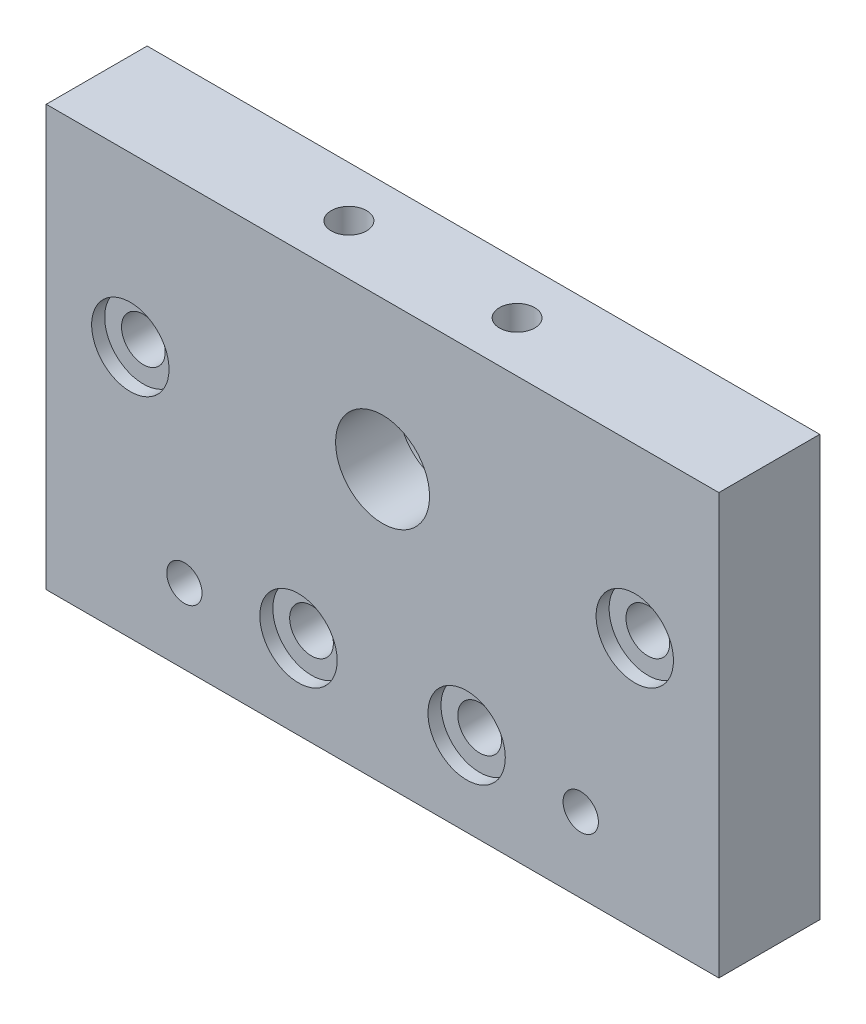
ISO-10303-21;
HEADER;
FILE_DESCRIPTION(('STEP AP214'),'2;1');
FILE_NAME('part.step','',(''),(''),'','','');
FILE_SCHEMA(('AUTOMOTIVE_DESIGN { 1 0 10303 214 1 1 1 1 }'));
ENDSEC;
DATA;
#1=APPLICATION_CONTEXT('core data for automotive mechanical design processes');
#2=APPLICATION_PROTOCOL_DEFINITION('international standard','automotive_design',2000,#1);
#3=PRODUCT_CONTEXT('',#1,'mechanical');
#4=PRODUCT('Part','Part','',(#3));
#5=PRODUCT_RELATED_PRODUCT_CATEGORY('part','',(#4));
#6=PRODUCT_DEFINITION_FORMATION('','',#4);
#7=PRODUCT_DEFINITION_CONTEXT('part definition',#1,'design');
#8=PRODUCT_DEFINITION('design','',#6,#7);
#9=PRODUCT_DEFINITION_SHAPE('','',#8);
#10=(LENGTH_UNIT() NAMED_UNIT(*) SI_UNIT(.MILLI.,.METRE.));
#11=(NAMED_UNIT(*) PLANE_ANGLE_UNIT() SI_UNIT($,.RADIAN.));
#12=(NAMED_UNIT(*) SI_UNIT($,.STERADIAN.) SOLID_ANGLE_UNIT());
#13=UNCERTAINTY_MEASURE_WITH_UNIT(LENGTH_MEASURE(1.E-05),#10,'distance_accuracy_value','');
#14=(GEOMETRIC_REPRESENTATION_CONTEXT(3) GLOBAL_UNCERTAINTY_ASSIGNED_CONTEXT((#13)) GLOBAL_UNIT_ASSIGNED_CONTEXT((#10,
#11,#12)) REPRESENTATION_CONTEXT('',''));
#15=CARTESIAN_POINT('',(0.,0.,0.));
#16=DIRECTION('',(0.,0.,1.));
#17=DIRECTION('',(1.,0.,0.));
#18=AXIS2_PLACEMENT_3D('',#15,#16,#17);
#19=CARTESIAN_POINT('',(40.,32.4,12.));
#20=DIRECTION('',(0.,0.,-1.));
#21=DIRECTION('',(-1.,0.,0.));
#22=AXIS2_PLACEMENT_3D('',#19,#20,#21);
#23=CYLINDRICAL_SURFACE('',#22,5.588);
#24=CARTESIAN_POINT('',(40.,32.4,12.));
#25=DIRECTION('',(0.,0.,1.));
#26=DIRECTION('',(1.,0.,0.));
#27=AXIS2_PLACEMENT_3D('',#24,#25,#26);
#28=CIRCLE('',#27,5.588);
#29=CARTESIAN_POINT('',(45.588,32.4,12.));
#30=VERTEX_POINT('',#29);
#31=EDGE_CURVE('E163',#30,#30,#28,.T.);
#32=ORIENTED_EDGE('',*,*,#31,.T.);
#33=EDGE_LOOP('',(#32));
#34=FACE_BOUND('',#33,.T.);
#35=CARTESIAN_POINT('',(40.,32.4,4.5));
#36=DIRECTION('',(0.,0.,-1.));
#37=DIRECTION('',(-1.,0.,0.));
#38=AXIS2_PLACEMENT_3D('',#35,#36,#37);
#39=CIRCLE('',#38,5.588);
#40=CARTESIAN_POINT('',(34.412,32.4,4.5));
#41=VERTEX_POINT('',#40);
#42=EDGE_CURVE('E36',#41,#41,#39,.T.);
#43=ORIENTED_EDGE('',*,*,#42,.T.);
#44=EDGE_LOOP('',(#43));
#45=FACE_BOUND('',#44,.T.);
#46=ADVANCED_FACE('F32',(#34,#45),#23,.F.);
#47=CARTESIAN_POINT('',(70.,30.,12.));
#48=DIRECTION('',(0.,0.,-1.));
#49=DIRECTION('',(-1.,0.,0.));
#50=AXIS2_PLACEMENT_3D('',#47,#48,#49);
#51=CYLINDRICAL_SURFACE('',#50,2.59999999999999);
#52=CARTESIAN_POINT('',(70.,30.,0.));
#53=DIRECTION('',(0.,0.,1.));
#54=DIRECTION('',(-1.,0.,0.));
#55=AXIS2_PLACEMENT_3D('',#52,#53,#54);
#56=CIRCLE('',#55,2.59999999999999);
#57=CARTESIAN_POINT('',(67.4,30.,0.));
#58=VERTEX_POINT('',#57);
#59=EDGE_CURVE('E151',#58,#58,#56,.T.);
#60=ORIENTED_EDGE('',*,*,#59,.F.);
#61=EDGE_LOOP('',(#60));
#62=FACE_BOUND('',#61,.T.);
#63=CARTESIAN_POINT('',(70.,30.,10.45));
#64=DIRECTION('',(0.,0.,1.));
#65=DIRECTION('',(1.,0.,0.));
#66=AXIS2_PLACEMENT_3D('',#63,#64,#65);
#67=CIRCLE('',#66,2.59999999999999);
#68=CARTESIAN_POINT('',(72.6,30.,10.45));
#69=VERTEX_POINT('',#68);
#70=EDGE_CURVE('E127',#69,#69,#67,.T.);
#71=ORIENTED_EDGE('',*,*,#70,.T.);
#72=EDGE_LOOP('',(#71));
#73=FACE_BOUND('',#72,.T.);
#74=ADVANCED_FACE('F192',(#62,#73),#51,.F.);
#75=CARTESIAN_POINT('',(50.,10.,12.));
#76=DIRECTION('',(0.,0.,-1.));
#77=DIRECTION('',(-1.,0.,0.));
#78=AXIS2_PLACEMENT_3D('',#75,#76,#77);
#79=CYLINDRICAL_SURFACE('',#78,2.59999999999999);
#80=CARTESIAN_POINT('',(50.,10.,0.));
#81=DIRECTION('',(0.,0.,1.));
#82=DIRECTION('',(-1.,0.,0.));
#83=AXIS2_PLACEMENT_3D('',#80,#81,#82);
#84=CIRCLE('',#83,2.59999999999999);
#85=CARTESIAN_POINT('',(47.4,10.,0.));
#86=VERTEX_POINT('',#85);
#87=EDGE_CURVE('E154',#86,#86,#84,.T.);
#88=ORIENTED_EDGE('',*,*,#87,.F.);
#89=EDGE_LOOP('',(#88));
#90=FACE_BOUND('',#89,.T.);
#91=CARTESIAN_POINT('',(50.,10.,10.45));
#92=DIRECTION('',(0.,0.,1.));
#93=DIRECTION('',(1.,0.,0.));
#94=AXIS2_PLACEMENT_3D('',#91,#92,#93);
#95=CIRCLE('',#94,2.59999999999999);
#96=CARTESIAN_POINT('',(52.6,10.,10.45));
#97=VERTEX_POINT('',#96);
#98=EDGE_CURVE('E133',#97,#97,#95,.T.);
#99=ORIENTED_EDGE('',*,*,#98,.T.);
#100=EDGE_LOOP('',(#99));
#101=FACE_BOUND('',#100,.T.);
#102=ADVANCED_FACE('F260',(#90,#101),#79,.F.);
#103=CARTESIAN_POINT('',(30.,10.,12.));
#104=DIRECTION('',(0.,0.,-1.));
#105=DIRECTION('',(-1.,0.,0.));
#106=AXIS2_PLACEMENT_3D('',#103,#104,#105);
#107=CYLINDRICAL_SURFACE('',#106,2.59999999999999);
#108=CARTESIAN_POINT('',(30.,10.,0.));
#109=DIRECTION('',(0.,0.,1.));
#110=DIRECTION('',(1.,0.,0.));
#111=AXIS2_PLACEMENT_3D('',#108,#109,#110);
#112=CIRCLE('',#111,2.59999999999999);
#113=CARTESIAN_POINT('',(32.6,10.,0.));
#114=VERTEX_POINT('',#113);
#115=EDGE_CURVE('E160',#114,#114,#112,.T.);
#116=ORIENTED_EDGE('',*,*,#115,.F.);
#117=EDGE_LOOP('',(#116));
#118=FACE_BOUND('',#117,.T.);
#119=CARTESIAN_POINT('',(30.,10.,10.45));
#120=DIRECTION('',(0.,0.,1.));
#121=DIRECTION('',(1.,0.,0.));
#122=AXIS2_PLACEMENT_3D('',#119,#120,#121);
#123=CIRCLE('',#122,2.59999999999999);
#124=CARTESIAN_POINT('',(32.6,10.,10.45));
#125=VERTEX_POINT('',#124);
#126=EDGE_CURVE('E140',#125,#125,#123,.T.);
#127=ORIENTED_EDGE('',*,*,#126,.T.);
#128=EDGE_LOOP('',(#127));
#129=FACE_BOUND('',#128,.T.);
#130=ADVANCED_FACE('F265',(#118,#129),#107,.F.);
#131=CARTESIAN_POINT('',(9.99999999999999,30.,12.));
#132=DIRECTION('',(0.,0.,-1.));
#133=DIRECTION('',(-1.,0.,0.));
#134=AXIS2_PLACEMENT_3D('',#131,#132,#133);
#135=CYLINDRICAL_SURFACE('',#134,2.6);
#136=CARTESIAN_POINT('',(9.99999999999999,30.,0.));
#137=DIRECTION('',(0.,0.,1.));
#138=DIRECTION('',(1.,0.,0.));
#139=AXIS2_PLACEMENT_3D('',#136,#137,#138);
#140=CIRCLE('',#139,2.6);
#141=CARTESIAN_POINT('',(12.6,30.,0.));
#142=VERTEX_POINT('',#141);
#143=EDGE_CURVE('E157',#142,#142,#140,.T.);
#144=ORIENTED_EDGE('',*,*,#143,.F.);
#145=EDGE_LOOP('',(#144));
#146=FACE_BOUND('',#145,.T.);
#147=CARTESIAN_POINT('',(9.99999999999999,30.,10.45));
#148=DIRECTION('',(0.,0.,1.));
#149=DIRECTION('',(1.,0.,0.));
#150=AXIS2_PLACEMENT_3D('',#147,#148,#149);
#151=CIRCLE('',#150,2.6);
#152=CARTESIAN_POINT('',(12.6,30.,10.45));
#153=VERTEX_POINT('',#152);
#154=EDGE_CURVE('E147',#153,#153,#151,.T.);
#155=ORIENTED_EDGE('',*,*,#154,.T.);
#156=EDGE_LOOP('',(#155));
#157=FACE_BOUND('',#156,.T.);
#158=ADVANCED_FACE('F212',(#146,#157),#135,.F.);
#159=CARTESIAN_POINT('',(0.,0.,12.));
#160=DIRECTION('',(0.,0.,-1.));
#161=DIRECTION('',(-1.,0.,0.));
#162=AXIS2_PLACEMENT_3D('',#159,#160,#161);
#163=PLANE('',#162);
#164=CARTESIAN_POINT('',(16.43,8.9,12.));
#165=DIRECTION('',(0.,0.,1.));
#166=DIRECTION('',(1.,0.,0.));
#167=AXIS2_PLACEMENT_3D('',#164,#165,#166);
#168=CIRCLE('',#167,2.09999999999999);
#169=CARTESIAN_POINT('',(18.53,8.9,12.));
#170=VERTEX_POINT('',#169);
#171=EDGE_CURVE('E111',#170,#170,#168,.T.);
#172=ORIENTED_EDGE('',*,*,#171,.F.);
#173=EDGE_LOOP('',(#172));
#174=FACE_BOUND('',#173,.T.);
#175=CARTESIAN_POINT('',(63.57,8.90000000000001,12.));
#176=DIRECTION('',(0.,0.,1.));
#177=DIRECTION('',(1.,0.,0.));
#178=AXIS2_PLACEMENT_3D('',#175,#176,#177);
#179=CIRCLE('',#178,2.09999999999999);
#180=CARTESIAN_POINT('',(65.67,8.90000000000001,12.));
#181=VERTEX_POINT('',#180);
#182=EDGE_CURVE('E117',#181,#181,#179,.T.);
#183=ORIENTED_EDGE('',*,*,#182,.F.);
#184=EDGE_LOOP('',(#183));
#185=FACE_BOUND('',#184,.T.);
#186=CARTESIAN_POINT('',(70.,30.,12.));
#187=DIRECTION('',(0.,0.,1.));
#188=DIRECTION('',(1.,0.,0.));
#189=AXIS2_PLACEMENT_3D('',#186,#187,#188);
#190=CIRCLE('',#189,4.6);
#191=CARTESIAN_POINT('',(74.6,30.,12.));
#192=VERTEX_POINT('',#191);
#193=EDGE_CURVE('E123',#192,#192,#190,.T.);
#194=ORIENTED_EDGE('',*,*,#193,.F.);
#195=EDGE_LOOP('',(#194));
#196=FACE_BOUND('',#195,.T.);
#197=CARTESIAN_POINT('',(50.,10.,12.));
#198=DIRECTION('',(0.,0.,1.));
#199=DIRECTION('',(1.,0.,0.));
#200=AXIS2_PLACEMENT_3D('',#197,#198,#199);
#201=CIRCLE('',#200,4.6);
#202=CARTESIAN_POINT('',(54.6,10.,12.));
#203=VERTEX_POINT('',#202);
#204=EDGE_CURVE('E134',#203,#203,#201,.T.);
#205=ORIENTED_EDGE('',*,*,#204,.F.);
#206=EDGE_LOOP('',(#205));
#207=FACE_BOUND('',#206,.T.);
#208=CARTESIAN_POINT('',(30.,10.,12.));
#209=DIRECTION('',(0.,0.,1.));
#210=DIRECTION('',(1.,0.,0.));
#211=AXIS2_PLACEMENT_3D('',#208,#209,#210);
#212=CIRCLE('',#211,4.6);
#213=CARTESIAN_POINT('',(34.6,10.,12.));
#214=VERTEX_POINT('',#213);
#215=EDGE_CURVE('E141',#214,#214,#212,.T.);
#216=ORIENTED_EDGE('',*,*,#215,.F.);
#217=EDGE_LOOP('',(#216));
#218=FACE_BOUND('',#217,.T.);
#219=CARTESIAN_POINT('',(9.99999999999999,30.,12.));
#220=DIRECTION('',(0.,0.,1.));
#221=DIRECTION('',(1.,0.,0.));
#222=AXIS2_PLACEMENT_3D('',#219,#220,#221);
#223=CIRCLE('',#222,4.6);
#224=CARTESIAN_POINT('',(14.6,30.,12.));
#225=VERTEX_POINT('',#224);
#226=EDGE_CURVE('E148',#225,#225,#223,.T.);
#227=ORIENTED_EDGE('',*,*,#226,.F.);
#228=EDGE_LOOP('',(#227));
#229=FACE_BOUND('',#228,.T.);
#230=DIRECTION('',(0.,-1.,0.));
#231=VECTOR('',#230,1.);
#232=CARTESIAN_POINT('',(0.,0.,12.));
#233=LINE('',#232,#231);
#234=CARTESIAN_POINT('',(0.,50.,12.));
#235=VERTEX_POINT('',#234);
#236=CARTESIAN_POINT('',(0.,0.,12.));
#237=VERTEX_POINT('',#236);
#238=EDGE_CURVE('E167',#235,#237,#233,.T.);
#239=ORIENTED_EDGE('',*,*,#238,.T.);
#240=DIRECTION('',(1.,0.,0.));
#241=VECTOR('',#240,1.);
#242=CARTESIAN_POINT('',(0.,0.,12.));
#243=LINE('',#242,#241);
#244=CARTESIAN_POINT('',(80.,0.,12.));
#245=VERTEX_POINT('',#244);
#246=EDGE_CURVE('E82',#237,#245,#243,.T.);
#247=ORIENTED_EDGE('',*,*,#246,.T.);
#248=DIRECTION('',(0.,1.,0.));
#249=VECTOR('',#248,1.);
#250=CARTESIAN_POINT('',(80.,0.,12.));
#251=LINE('',#250,#249);
#252=CARTESIAN_POINT('',(80.,50.,12.));
#253=VERTEX_POINT('',#252);
#254=EDGE_CURVE('E170',#245,#253,#251,.T.);
#255=ORIENTED_EDGE('',*,*,#254,.T.);
#256=DIRECTION('',(-1.,0.,0.));
#257=VECTOR('',#256,1.);
#258=CARTESIAN_POINT('',(0.,50.,12.));
#259=LINE('',#258,#257);
#260=EDGE_CURVE('E51',#253,#235,#259,.T.);
#261=ORIENTED_EDGE('',*,*,#260,.T.);
#262=EDGE_LOOP('',(#239,#247,#255,#261));
#263=FACE_BOUND('',#262,.T.);
#264=ORIENTED_EDGE('',*,*,#31,.F.);
#265=EDGE_LOOP('',(#264));
#266=FACE_BOUND('',#265,.T.);
#267=ADVANCED_FACE('F208',(#174,#185,#196,#207,#218,#229,#263,#266),#163,.F.);
#268=CARTESIAN_POINT('',(0.,0.,0.));
#269=DIRECTION('',(0.,0.,-1.));
#270=DIRECTION('',(-1.,0.,0.));
#271=AXIS2_PLACEMENT_3D('',#268,#269,#270);
#272=PLANE('',#271);
#273=CARTESIAN_POINT('',(40.,32.4,0.));
#274=DIRECTION('',(0.,0.,-1.));
#275=DIRECTION('',(-1.,0.,0.));
#276=AXIS2_PLACEMENT_3D('',#273,#274,#275);
#277=CIRCLE('',#276,8.05);
#278=CARTESIAN_POINT('',(31.95,32.4,0.));
#279=VERTEX_POINT('',#278);
#280=EDGE_CURVE('E233',#279,#279,#277,.T.);
#281=ORIENTED_EDGE('',*,*,#280,.F.);
#282=EDGE_LOOP('',(#281));
#283=FACE_BOUND('',#282,.T.);
#284=CARTESIAN_POINT('',(16.43,8.9,0.));
#285=DIRECTION('',(0.,0.,1.));
#286=DIRECTION('',(1.,0.,0.));
#287=AXIS2_PLACEMENT_3D('',#284,#285,#286);
#288=CIRCLE('',#287,2.1);
#289=CARTESIAN_POINT('',(18.53,8.9,0.));
#290=VERTEX_POINT('',#289);
#291=EDGE_CURVE('E114',#290,#290,#288,.T.);
#292=ORIENTED_EDGE('',*,*,#291,.T.);
#293=EDGE_LOOP('',(#292));
#294=FACE_BOUND('',#293,.T.);
#295=CARTESIAN_POINT('',(63.57,8.90000000000001,0.));
#296=DIRECTION('',(0.,0.,1.));
#297=DIRECTION('',(1.,0.,0.));
#298=AXIS2_PLACEMENT_3D('',#295,#296,#297);
#299=CIRCLE('',#298,2.1);
#300=CARTESIAN_POINT('',(65.67,8.90000000000001,0.));
#301=VERTEX_POINT('',#300);
#302=EDGE_CURVE('E120',#301,#301,#299,.T.);
#303=ORIENTED_EDGE('',*,*,#302,.T.);
#304=EDGE_LOOP('',(#303));
#305=FACE_BOUND('',#304,.T.);
#306=ORIENTED_EDGE('',*,*,#87,.T.);
#307=EDGE_LOOP('',(#306));
#308=FACE_BOUND('',#307,.T.);
#309=ORIENTED_EDGE('',*,*,#115,.T.);
#310=EDGE_LOOP('',(#309));
#311=FACE_BOUND('',#310,.T.);
#312=DIRECTION('',(0.,-1.,0.));
#313=VECTOR('',#312,1.);
#314=CARTESIAN_POINT('',(0.,0.,0.));
#315=LINE('',#314,#313);
#316=CARTESIAN_POINT('',(0.,50.,0.));
#317=VERTEX_POINT('',#316);
#318=CARTESIAN_POINT('',(0.,0.,0.));
#319=VERTEX_POINT('',#318);
#320=EDGE_CURVE('E166',#317,#319,#315,.T.);
#321=ORIENTED_EDGE('',*,*,#320,.F.);
#322=DIRECTION('',(-1.,0.,0.));
#323=VECTOR('',#322,1.);
#324=CARTESIAN_POINT('',(0.,50.,0.));
#325=LINE('',#324,#323);
#326=CARTESIAN_POINT('',(80.,50.,0.));
#327=VERTEX_POINT('',#326);
#328=EDGE_CURVE('E75',#327,#317,#325,.T.);
#329=ORIENTED_EDGE('',*,*,#328,.F.);
#330=DIRECTION('',(0.,1.,0.));
#331=VECTOR('',#330,1.);
#332=CARTESIAN_POINT('',(80.,0.,0.));
#333=LINE('',#332,#331);
#334=CARTESIAN_POINT('',(80.,0.,0.));
#335=VERTEX_POINT('',#334);
#336=EDGE_CURVE('E69',#335,#327,#333,.T.);
#337=ORIENTED_EDGE('',*,*,#336,.F.);
#338=DIRECTION('',(1.,0.,0.));
#339=VECTOR('',#338,1.);
#340=CARTESIAN_POINT('',(0.,0.,0.));
#341=LINE('',#340,#339);
#342=EDGE_CURVE('E176',#319,#335,#341,.T.);
#343=ORIENTED_EDGE('',*,*,#342,.F.);
#344=EDGE_LOOP('',(#321,#329,#337,#343));
#345=FACE_BOUND('',#344,.T.);
#346=ORIENTED_EDGE('',*,*,#143,.T.);
#347=EDGE_LOOP('',(#346));
#348=FACE_BOUND('',#347,.T.);
#349=ORIENTED_EDGE('',*,*,#59,.T.);
#350=EDGE_LOOP('',(#349));
#351=FACE_BOUND('',#350,.T.);
#352=ADVANCED_FACE('F211',(#283,#294,#305,#308,#311,#345,#348,#351),#272,.T.);
#353=CARTESIAN_POINT('',(0.,0.,12.));
#354=DIRECTION('',(1.,0.,0.));
#355=DIRECTION('',(0.,0.,-1.));
#356=AXIS2_PLACEMENT_3D('',#353,#354,#355);
#357=PLANE('',#356);
#358=ORIENTED_EDGE('',*,*,#320,.T.);
#359=DIRECTION('',(0.,0.,-1.));
#360=VECTOR('',#359,1.);
#361=CARTESIAN_POINT('',(0.,0.,12.));
#362=LINE('',#361,#360);
#363=EDGE_CURVE('E11',#237,#319,#362,.T.);
#364=ORIENTED_EDGE('',*,*,#363,.F.);
#365=ORIENTED_EDGE('',*,*,#238,.F.);
#366=DIRECTION('',(0.,0.,-1.));
#367=VECTOR('',#366,1.);
#368=CARTESIAN_POINT('',(0.,50.,12.));
#369=LINE('',#368,#367);
#370=EDGE_CURVE('E173',#235,#317,#369,.T.);
#371=ORIENTED_EDGE('',*,*,#370,.T.);
#372=EDGE_LOOP('',(#358,#364,#365,#371));
#373=FACE_BOUND('',#372,.T.);
#374=ADVANCED_FACE('F34',(#373),#357,.F.);
#375=CARTESIAN_POINT('',(0.,0.,12.));
#376=DIRECTION('',(0.,1.,0.));
#377=DIRECTION('',(0.,0.,1.));
#378=AXIS2_PLACEMENT_3D('',#375,#376,#377);
#379=PLANE('',#378);
#380=ORIENTED_EDGE('',*,*,#342,.T.);
#381=DIRECTION('',(0.,0.,-1.));
#382=VECTOR('',#381,1.);
#383=CARTESIAN_POINT('',(80.,0.,12.));
#384=LINE('',#383,#382);
#385=EDGE_CURVE('E42',#245,#335,#384,.T.);
#386=ORIENTED_EDGE('',*,*,#385,.F.);
#387=ORIENTED_EDGE('',*,*,#246,.F.);
#388=ORIENTED_EDGE('',*,*,#363,.T.);
#389=EDGE_LOOP('',(#380,#386,#387,#388));
#390=FACE_BOUND('',#389,.T.);
#391=ADVANCED_FACE('F284',(#390),#379,.F.);
#392=CARTESIAN_POINT('',(80.,0.,12.));
#393=DIRECTION('',(-1.,0.,0.));
#394=DIRECTION('',(0.,0.,1.));
#395=AXIS2_PLACEMENT_3D('',#392,#393,#394);
#396=PLANE('',#395);
#397=ORIENTED_EDGE('',*,*,#336,.T.);
#398=DIRECTION('',(0.,0.,-1.));
#399=VECTOR('',#398,1.);
#400=CARTESIAN_POINT('',(80.,50.,12.));
#401=LINE('',#400,#399);
#402=EDGE_CURVE('E181',#253,#327,#401,.T.);
#403=ORIENTED_EDGE('',*,*,#402,.F.);
#404=ORIENTED_EDGE('',*,*,#254,.F.);
#405=ORIENTED_EDGE('',*,*,#385,.T.);
#406=EDGE_LOOP('',(#397,#403,#404,#405));
#407=FACE_BOUND('',#406,.T.);
#408=ADVANCED_FACE('F281',(#407),#396,.F.);
#409=CARTESIAN_POINT('',(0.,50.,12.));
#410=DIRECTION('',(0.,-1.,0.));
#411=DIRECTION('',(0.,0.,-1.));
#412=AXIS2_PLACEMENT_3D('',#409,#410,#411);
#413=PLANE('',#412);
#414=CARTESIAN_POINT('',(30.,50.,6.));
#415=DIRECTION('',(0.,1.,0.));
#416=DIRECTION('',(0.,0.,1.));
#417=AXIS2_PLACEMENT_3D('',#414,#415,#416);
#418=CIRCLE('',#417,2.09999999999999);
#419=CARTESIAN_POINT('',(30.,50.,8.09999999999999));
#420=VERTEX_POINT('',#419);
#421=EDGE_CURVE('E100',#420,#420,#418,.T.);
#422=ORIENTED_EDGE('',*,*,#421,.F.);
#423=EDGE_LOOP('',(#422));
#424=FACE_BOUND('',#423,.T.);
#425=CARTESIAN_POINT('',(50.,50.,6.));
#426=DIRECTION('',(0.,1.,0.));
#427=DIRECTION('',(0.,0.,1.));
#428=AXIS2_PLACEMENT_3D('',#425,#426,#427);
#429=CIRCLE('',#428,2.09999999999999);
#430=CARTESIAN_POINT('',(50.,50.,8.09999999999999));
#431=VERTEX_POINT('',#430);
#432=EDGE_CURVE('E99',#431,#431,#429,.T.);
#433=ORIENTED_EDGE('',*,*,#432,.F.);
#434=EDGE_LOOP('',(#433));
#435=FACE_BOUND('',#434,.T.);
#436=ORIENTED_EDGE('',*,*,#328,.T.);
#437=ORIENTED_EDGE('',*,*,#370,.F.);
#438=ORIENTED_EDGE('',*,*,#260,.F.);
#439=ORIENTED_EDGE('',*,*,#402,.T.);
#440=EDGE_LOOP('',(#436,#437,#438,#439));
#441=FACE_BOUND('',#440,.T.);
#442=ADVANCED_FACE('F278',(#424,#435,#441),#413,.F.);
#443=CARTESIAN_POINT('',(9.99999999999999,30.,10.45));
#444=DIRECTION('',(0.,0.,1.));
#445=DIRECTION('',(1.,0.,0.));
#446=AXIS2_PLACEMENT_3D('',#443,#444,#445);
#447=CYLINDRICAL_SURFACE('',#446,4.6);
#448=CARTESIAN_POINT('',(9.99999999999999,30.,10.45));
#449=DIRECTION('',(0.,0.,1.));
#450=DIRECTION('',(1.,0.,0.));
#451=AXIS2_PLACEMENT_3D('',#448,#449,#450);
#452=CIRCLE('',#451,4.6);
#453=CARTESIAN_POINT('',(14.6,30.,10.45));
#454=VERTEX_POINT('',#453);
#455=EDGE_CURVE('E144',#454,#454,#452,.T.);
#456=CARTESIAN_POINT('',(14.6,30.,10.45));
#457=CARTESIAN_POINT('',(14.6,30.,10.4661458333333));
#458=CARTESIAN_POINT('',(14.6,30.,10.4822916666667));
#459=CARTESIAN_POINT('',(14.6,30.,10.5145833333333));
#460=CARTESIAN_POINT('',(14.6,30.,10.5307291666667));
#461=CARTESIAN_POINT('',(14.6,30.,10.5630208333333));
#462=CARTESIAN_POINT('',(14.6,30.,10.5791666666667));
#463=CARTESIAN_POINT('',(14.6,30.,10.6114583333333));
#464=CARTESIAN_POINT('',(14.6,30.,10.6276041666667));
#465=CARTESIAN_POINT('',(14.6,30.,10.6598958333333));
#466=CARTESIAN_POINT('',(14.6,30.,10.6760416666667));
#467=CARTESIAN_POINT('',(14.6,30.,10.7083333333333));
#468=CARTESIAN_POINT('',(14.6,30.,10.7244791666667));
#469=CARTESIAN_POINT('',(14.6,30.,10.7567708333333));
#470=CARTESIAN_POINT('',(14.6,30.,10.7729166666667));
#471=CARTESIAN_POINT('',(14.6,30.,10.8052083333333));
#472=CARTESIAN_POINT('',(14.6,30.,10.8213541666667));
#473=CARTESIAN_POINT('',(14.6,30.,10.8536458333333));
#474=CARTESIAN_POINT('',(14.6,30.,10.8697916666667));
#475=CARTESIAN_POINT('',(14.6,30.,10.9020833333333));
#476=CARTESIAN_POINT('',(14.6,30.,10.9182291666667));
#477=CARTESIAN_POINT('',(14.6,30.,10.9505208333333));
#478=CARTESIAN_POINT('',(14.6,30.,10.9666666666667));
#479=CARTESIAN_POINT('',(14.6,30.,10.9989583333333));
#480=CARTESIAN_POINT('',(14.6,30.,11.0151041666667));
#481=CARTESIAN_POINT('',(14.6,30.,11.0473958333333));
#482=CARTESIAN_POINT('',(14.6,30.,11.0635416666667));
#483=CARTESIAN_POINT('',(14.6,30.,11.0958333333333));
#484=CARTESIAN_POINT('',(14.6,30.,11.1119791666667));
#485=CARTESIAN_POINT('',(14.6,30.,11.1442708333333));
#486=CARTESIAN_POINT('',(14.6,30.,11.1604166666667));
#487=CARTESIAN_POINT('',(14.6,30.,11.1927083333333));
#488=CARTESIAN_POINT('',(14.6,30.,11.2088541666667));
#489=CARTESIAN_POINT('',(14.6,30.,11.2411458333333));
#490=CARTESIAN_POINT('',(14.6,30.,11.2572916666667));
#491=CARTESIAN_POINT('',(14.6,30.,11.2895833333333));
#492=CARTESIAN_POINT('',(14.6,30.,11.3057291666667));
#493=CARTESIAN_POINT('',(14.6,30.,11.3380208333333));
#494=CARTESIAN_POINT('',(14.6,30.,11.3541666666667));
#495=CARTESIAN_POINT('',(14.6,30.,11.3864583333333));
#496=CARTESIAN_POINT('',(14.6,30.,11.4026041666667));
#497=CARTESIAN_POINT('',(14.6,30.,11.4348958333333));
#498=CARTESIAN_POINT('',(14.6,30.,11.4510416666667));
#499=CARTESIAN_POINT('',(14.6,30.,11.4833333333333));
#500=CARTESIAN_POINT('',(14.6,30.,11.4994791666667));
#501=CARTESIAN_POINT('',(14.6,30.,11.5317708333333));
#502=CARTESIAN_POINT('',(14.6,30.,11.5479166666667));
#503=CARTESIAN_POINT('',(14.6,30.,11.5802083333333));
#504=CARTESIAN_POINT('',(14.6,30.,11.5963541666667));
#505=CARTESIAN_POINT('',(14.6,30.,11.6286458333333));
#506=CARTESIAN_POINT('',(14.6,30.,11.6447916666667));
#507=CARTESIAN_POINT('',(14.6,30.,11.6770833333333));
#508=CARTESIAN_POINT('',(14.6,30.,11.6932291666667));
#509=CARTESIAN_POINT('',(14.6,30.,11.7255208333333));
#510=CARTESIAN_POINT('',(14.6,30.,11.7416666666667));
#511=CARTESIAN_POINT('',(14.6,30.,11.7739583333333));
#512=CARTESIAN_POINT('',(14.6,30.,11.7901041666667));
#513=CARTESIAN_POINT('',(14.6,30.,11.8223958333333));
#514=CARTESIAN_POINT('',(14.6,30.,11.8385416666667));
#515=CARTESIAN_POINT('',(14.6,30.,11.8708333333333));
#516=CARTESIAN_POINT('',(14.6,30.,11.8869791666667));
#517=CARTESIAN_POINT('',(14.6,30.,11.9192708333333));
#518=CARTESIAN_POINT('',(14.6,30.,11.9354166666667));
#519=CARTESIAN_POINT('',(14.6,30.,11.9677083333333));
#520=CARTESIAN_POINT('',(14.6,30.,11.9838541666667));
#521=CARTESIAN_POINT('',(14.6,30.,12.));
#522=B_SPLINE_CURVE_WITH_KNOTS('',3,(#456,#457,#458,#459,#460,#461,#462,#463,#464,#465,#466,
#467,#468,#469,#470,#471,#472,#473,#474,#475,#476,#477,#478,#479,#480,#481,#482,#483,#484,#485,
#486,#487,#488,#489,#490,#491,#492,#493,#494,#495,#496,#497,#498,#499,#500,#501,#502,#503,#504,
#505,#506,#507,#508,#509,#510,#511,#512,#513,#514,#515,#516,#517,#518,#519,#520,#521),
.UNSPECIFIED.,.F.,.F.,(4,2,2,2,2,2,2,2,2,2,2,2,2,2,2,2,2,2,2,2,2,2,2,2,2,2,2,2,2,2,2,2,4),(0.,
0.0484374999999999,0.0968749999999997,0.1453125,0.193749999999999,0.242187499999999,
0.290624999999999,0.339062499999999,0.387499999999999,0.435937499999999,0.484374999999999,
0.532812499999999,0.581249999999998,0.629687499999998,0.678124999999998,0.726562499999998,
0.774999999999998,0.823437499999999,0.871874999999999,0.920312499999999,0.968749999999999,
1.0171875,1.065625,1.1140625,1.1625,1.2109375,1.259375,1.3078125,1.35625,1.4046875,1.453125,
1.5015625,1.55),.UNSPECIFIED.);
#523=EDGE_CURVE('BSEAM269',#454,#225,#522,.T.);
#524=ORIENTED_EDGE('',*,*,#455,.F.);
#525=ORIENTED_EDGE('',*,*,#226,.T.);
#526=ORIENTED_EDGE('',*,*,#523,.T.);
#527=ORIENTED_EDGE('',*,*,#523,.F.);
#528=EDGE_LOOP('',(#524,#526,#525,#527));
#529=FACE_BOUND('',#528,.T.);
#530=ADVANCED_FACE('F269',(#529),#447,.F.);
#531=CARTESIAN_POINT('',(9.99999999999999,30.,10.45));
#532=DIRECTION('',(0.,0.,1.));
#533=DIRECTION('',(1.,0.,0.));
#534=AXIS2_PLACEMENT_3D('',#531,#532,#533);
#535=PLANE('',#534);
#536=ORIENTED_EDGE('',*,*,#154,.F.);
#537=EDGE_LOOP('',(#536));
#538=FACE_BOUND('',#537,.T.);
#539=ORIENTED_EDGE('',*,*,#455,.T.);
#540=EDGE_LOOP('',(#539));
#541=FACE_BOUND('',#540,.T.);
#542=ADVANCED_FACE('F352',(#538,#541),#535,.T.);
#543=CARTESIAN_POINT('',(30.,10.,10.45));
#544=DIRECTION('',(0.,0.,1.));
#545=DIRECTION('',(1.,0.,0.));
#546=AXIS2_PLACEMENT_3D('',#543,#544,#545);
#547=CYLINDRICAL_SURFACE('',#546,4.6);
#548=CARTESIAN_POINT('',(30.,10.,10.45));
#549=DIRECTION('',(0.,0.,1.));
#550=DIRECTION('',(1.,0.,0.));
#551=AXIS2_PLACEMENT_3D('',#548,#549,#550);
#552=CIRCLE('',#551,4.6);
#553=CARTESIAN_POINT('',(34.6,10.,10.45));
#554=VERTEX_POINT('',#553);
#555=EDGE_CURVE('E137',#554,#554,#552,.T.);
#556=CARTESIAN_POINT('',(34.6,10.,10.45));
#557=CARTESIAN_POINT('',(34.6,10.,10.4661458333333));
#558=CARTESIAN_POINT('',(34.6,10.,10.4822916666667));
#559=CARTESIAN_POINT('',(34.6,10.,10.5145833333333));
#560=CARTESIAN_POINT('',(34.6,10.,10.5307291666667));
#561=CARTESIAN_POINT('',(34.6,10.,10.5630208333333));
#562=CARTESIAN_POINT('',(34.6,10.,10.5791666666667));
#563=CARTESIAN_POINT('',(34.6,10.,10.6114583333333));
#564=CARTESIAN_POINT('',(34.6,10.,10.6276041666667));
#565=CARTESIAN_POINT('',(34.6,10.,10.6598958333333));
#566=CARTESIAN_POINT('',(34.6,10.,10.6760416666667));
#567=CARTESIAN_POINT('',(34.6,10.,10.7083333333333));
#568=CARTESIAN_POINT('',(34.6,10.,10.7244791666667));
#569=CARTESIAN_POINT('',(34.6,10.,10.7567708333333));
#570=CARTESIAN_POINT('',(34.6,10.,10.7729166666667));
#571=CARTESIAN_POINT('',(34.6,10.,10.8052083333333));
#572=CARTESIAN_POINT('',(34.6,10.,10.8213541666667));
#573=CARTESIAN_POINT('',(34.6,10.,10.8536458333333));
#574=CARTESIAN_POINT('',(34.6,10.,10.8697916666667));
#575=CARTESIAN_POINT('',(34.6,10.,10.9020833333333));
#576=CARTESIAN_POINT('',(34.6,10.,10.9182291666667));
#577=CARTESIAN_POINT('',(34.6,10.,10.9505208333333));
#578=CARTESIAN_POINT('',(34.6,10.,10.9666666666667));
#579=CARTESIAN_POINT('',(34.6,10.,10.9989583333333));
#580=CARTESIAN_POINT('',(34.6,10.,11.0151041666667));
#581=CARTESIAN_POINT('',(34.6,10.,11.0473958333333));
#582=CARTESIAN_POINT('',(34.6,10.,11.0635416666667));
#583=CARTESIAN_POINT('',(34.6,10.,11.0958333333333));
#584=CARTESIAN_POINT('',(34.6,10.,11.1119791666667));
#585=CARTESIAN_POINT('',(34.6,10.,11.1442708333333));
#586=CARTESIAN_POINT('',(34.6,10.,11.1604166666667));
#587=CARTESIAN_POINT('',(34.6,10.,11.1927083333333));
#588=CARTESIAN_POINT('',(34.6,10.,11.2088541666667));
#589=CARTESIAN_POINT('',(34.6,10.,11.2411458333333));
#590=CARTESIAN_POINT('',(34.6,10.,11.2572916666667));
#591=CARTESIAN_POINT('',(34.6,10.,11.2895833333333));
#592=CARTESIAN_POINT('',(34.6,10.,11.3057291666667));
#593=CARTESIAN_POINT('',(34.6,10.,11.3380208333333));
#594=CARTESIAN_POINT('',(34.6,10.,11.3541666666667));
#595=CARTESIAN_POINT('',(34.6,10.,11.3864583333333));
#596=CARTESIAN_POINT('',(34.6,10.,11.4026041666667));
#597=CARTESIAN_POINT('',(34.6,10.,11.4348958333333));
#598=CARTESIAN_POINT('',(34.6,10.,11.4510416666667));
#599=CARTESIAN_POINT('',(34.6,10.,11.4833333333333));
#600=CARTESIAN_POINT('',(34.6,10.,11.4994791666667));
#601=CARTESIAN_POINT('',(34.6,10.,11.5317708333333));
#602=CARTESIAN_POINT('',(34.6,10.,11.5479166666667));
#603=CARTESIAN_POINT('',(34.6,10.,11.5802083333333));
#604=CARTESIAN_POINT('',(34.6,10.,11.5963541666667));
#605=CARTESIAN_POINT('',(34.6,10.,11.6286458333333));
#606=CARTESIAN_POINT('',(34.6,10.,11.6447916666667));
#607=CARTESIAN_POINT('',(34.6,10.,11.6770833333333));
#608=CARTESIAN_POINT('',(34.6,10.,11.6932291666667));
#609=CARTESIAN_POINT('',(34.6,10.,11.7255208333333));
#610=CARTESIAN_POINT('',(34.6,10.,11.7416666666667));
#611=CARTESIAN_POINT('',(34.6,10.,11.7739583333333));
#612=CARTESIAN_POINT('',(34.6,10.,11.7901041666667));
#613=CARTESIAN_POINT('',(34.6,10.,11.8223958333333));
#614=CARTESIAN_POINT('',(34.6,10.,11.8385416666667));
#615=CARTESIAN_POINT('',(34.6,10.,11.8708333333333));
#616=CARTESIAN_POINT('',(34.6,10.,11.8869791666667));
#617=CARTESIAN_POINT('',(34.6,10.,11.9192708333333));
#618=CARTESIAN_POINT('',(34.6,10.,11.9354166666667));
#619=CARTESIAN_POINT('',(34.6,10.,11.9677083333333));
#620=CARTESIAN_POINT('',(34.6,10.,11.9838541666667));
#621=CARTESIAN_POINT('',(34.6,10.,12.));
#622=B_SPLINE_CURVE_WITH_KNOTS('',3,(#556,#557,#558,#559,#560,#561,#562,#563,#564,#565,#566,
#567,#568,#569,#570,#571,#572,#573,#574,#575,#576,#577,#578,#579,#580,#581,#582,#583,#584,#585,
#586,#587,#588,#589,#590,#591,#592,#593,#594,#595,#596,#597,#598,#599,#600,#601,#602,#603,#604,
#605,#606,#607,#608,#609,#610,#611,#612,#613,#614,#615,#616,#617,#618,#619,#620,#621),
.UNSPECIFIED.,.F.,.F.,(4,2,2,2,2,2,2,2,2,2,2,2,2,2,2,2,2,2,2,2,2,2,2,2,2,2,2,2,2,2,2,2,4),(0.,
0.0484374999999999,0.0968749999999997,0.1453125,0.193749999999999,0.242187499999999,
0.290624999999999,0.339062499999999,0.387499999999999,0.435937499999999,0.484374999999999,
0.532812499999999,0.581249999999998,0.629687499999998,0.678124999999998,0.726562499999998,
0.774999999999998,0.823437499999999,0.871874999999999,0.920312499999999,0.968749999999999,
1.0171875,1.065625,1.1140625,1.1625,1.2109375,1.259375,1.3078125,1.35625,1.4046875,1.453125,
1.5015625,1.55),.UNSPECIFIED.);
#623=EDGE_CURVE('BSEAM358',#554,#214,#622,.T.);
#624=ORIENTED_EDGE('',*,*,#555,.F.);
#625=ORIENTED_EDGE('',*,*,#215,.T.);
#626=ORIENTED_EDGE('',*,*,#623,.T.);
#627=ORIENTED_EDGE('',*,*,#623,.F.);
#628=EDGE_LOOP('',(#624,#626,#625,#627));
#629=FACE_BOUND('',#628,.T.);
#630=ADVANCED_FACE('F358',(#629),#547,.F.);
#631=CARTESIAN_POINT('',(30.,10.,10.45));
#632=DIRECTION('',(0.,0.,1.));
#633=DIRECTION('',(1.,0.,0.));
#634=AXIS2_PLACEMENT_3D('',#631,#632,#633);
#635=PLANE('',#634);
#636=ORIENTED_EDGE('',*,*,#126,.F.);
#637=EDGE_LOOP('',(#636));
#638=FACE_BOUND('',#637,.T.);
#639=ORIENTED_EDGE('',*,*,#555,.T.);
#640=EDGE_LOOP('',(#639));
#641=FACE_BOUND('',#640,.T.);
#642=ADVANCED_FACE('F365',(#638,#641),#635,.T.);
#643=CARTESIAN_POINT('',(50.,10.,10.45));
#644=DIRECTION('',(0.,0.,1.));
#645=DIRECTION('',(1.,0.,0.));
#646=AXIS2_PLACEMENT_3D('',#643,#644,#645);
#647=CYLINDRICAL_SURFACE('',#646,4.6);
#648=CARTESIAN_POINT('',(50.,10.,10.45));
#649=DIRECTION('',(0.,0.,1.));
#650=DIRECTION('',(1.,0.,0.));
#651=AXIS2_PLACEMENT_3D('',#648,#649,#650);
#652=CIRCLE('',#651,4.6);
#653=CARTESIAN_POINT('',(54.6,10.,10.45));
#654=VERTEX_POINT('',#653);
#655=EDGE_CURVE('E130',#654,#654,#652,.T.);
#656=CARTESIAN_POINT('',(54.6,10.,10.45));
#657=CARTESIAN_POINT('',(54.6,10.,10.4661458333333));
#658=CARTESIAN_POINT('',(54.6,10.,10.4822916666667));
#659=CARTESIAN_POINT('',(54.6,10.,10.5145833333333));
#660=CARTESIAN_POINT('',(54.6,10.,10.5307291666667));
#661=CARTESIAN_POINT('',(54.6,10.,10.5630208333333));
#662=CARTESIAN_POINT('',(54.6,10.,10.5791666666667));
#663=CARTESIAN_POINT('',(54.6,10.,10.6114583333333));
#664=CARTESIAN_POINT('',(54.6,10.,10.6276041666667));
#665=CARTESIAN_POINT('',(54.6,10.,10.6598958333333));
#666=CARTESIAN_POINT('',(54.6,10.,10.6760416666667));
#667=CARTESIAN_POINT('',(54.6,10.,10.7083333333333));
#668=CARTESIAN_POINT('',(54.6,10.,10.7244791666667));
#669=CARTESIAN_POINT('',(54.6,10.,10.7567708333333));
#670=CARTESIAN_POINT('',(54.6,10.,10.7729166666667));
#671=CARTESIAN_POINT('',(54.6,10.,10.8052083333333));
#672=CARTESIAN_POINT('',(54.6,10.,10.8213541666667));
#673=CARTESIAN_POINT('',(54.6,10.,10.8536458333333));
#674=CARTESIAN_POINT('',(54.6,10.,10.8697916666667));
#675=CARTESIAN_POINT('',(54.6,10.,10.9020833333333));
#676=CARTESIAN_POINT('',(54.6,10.,10.9182291666667));
#677=CARTESIAN_POINT('',(54.6,10.,10.9505208333333));
#678=CARTESIAN_POINT('',(54.6,10.,10.9666666666667));
#679=CARTESIAN_POINT('',(54.6,10.,10.9989583333333));
#680=CARTESIAN_POINT('',(54.6,10.,11.0151041666667));
#681=CARTESIAN_POINT('',(54.6,10.,11.0473958333333));
#682=CARTESIAN_POINT('',(54.6,10.,11.0635416666667));
#683=CARTESIAN_POINT('',(54.6,10.,11.0958333333333));
#684=CARTESIAN_POINT('',(54.6,10.,11.1119791666667));
#685=CARTESIAN_POINT('',(54.6,10.,11.1442708333333));
#686=CARTESIAN_POINT('',(54.6,10.,11.1604166666667));
#687=CARTESIAN_POINT('',(54.6,10.,11.1927083333333));
#688=CARTESIAN_POINT('',(54.6,10.,11.2088541666667));
#689=CARTESIAN_POINT('',(54.6,10.,11.2411458333333));
#690=CARTESIAN_POINT('',(54.6,10.,11.2572916666667));
#691=CARTESIAN_POINT('',(54.6,10.,11.2895833333333));
#692=CARTESIAN_POINT('',(54.6,10.,11.3057291666667));
#693=CARTESIAN_POINT('',(54.6,10.,11.3380208333333));
#694=CARTESIAN_POINT('',(54.6,10.,11.3541666666667));
#695=CARTESIAN_POINT('',(54.6,10.,11.3864583333333));
#696=CARTESIAN_POINT('',(54.6,10.,11.4026041666667));
#697=CARTESIAN_POINT('',(54.6,10.,11.4348958333333));
#698=CARTESIAN_POINT('',(54.6,10.,11.4510416666667));
#699=CARTESIAN_POINT('',(54.6,10.,11.4833333333333));
#700=CARTESIAN_POINT('',(54.6,10.,11.4994791666667));
#701=CARTESIAN_POINT('',(54.6,10.,11.5317708333333));
#702=CARTESIAN_POINT('',(54.6,10.,11.5479166666667));
#703=CARTESIAN_POINT('',(54.6,10.,11.5802083333333));
#704=CARTESIAN_POINT('',(54.6,10.,11.5963541666667));
#705=CARTESIAN_POINT('',(54.6,10.,11.6286458333333));
#706=CARTESIAN_POINT('',(54.6,10.,11.6447916666667));
#707=CARTESIAN_POINT('',(54.6,10.,11.6770833333333));
#708=CARTESIAN_POINT('',(54.6,10.,11.6932291666667));
#709=CARTESIAN_POINT('',(54.6,10.,11.7255208333333));
#710=CARTESIAN_POINT('',(54.6,10.,11.7416666666667));
#711=CARTESIAN_POINT('',(54.6,10.,11.7739583333333));
#712=CARTESIAN_POINT('',(54.6,10.,11.7901041666667));
#713=CARTESIAN_POINT('',(54.6,10.,11.8223958333333));
#714=CARTESIAN_POINT('',(54.6,10.,11.8385416666667));
#715=CARTESIAN_POINT('',(54.6,10.,11.8708333333333));
#716=CARTESIAN_POINT('',(54.6,10.,11.8869791666667));
#717=CARTESIAN_POINT('',(54.6,10.,11.9192708333333));
#718=CARTESIAN_POINT('',(54.6,10.,11.9354166666667));
#719=CARTESIAN_POINT('',(54.6,10.,11.9677083333333));
#720=CARTESIAN_POINT('',(54.6,10.,11.9838541666667));
#721=CARTESIAN_POINT('',(54.6,10.,12.));
#722=B_SPLINE_CURVE_WITH_KNOTS('',3,(#656,#657,#658,#659,#660,#661,#662,#663,#664,#665,#666,
#667,#668,#669,#670,#671,#672,#673,#674,#675,#676,#677,#678,#679,#680,#681,#682,#683,#684,#685,
#686,#687,#688,#689,#690,#691,#692,#693,#694,#695,#696,#697,#698,#699,#700,#701,#702,#703,#704,
#705,#706,#707,#708,#709,#710,#711,#712,#713,#714,#715,#716,#717,#718,#719,#720,#721),
.UNSPECIFIED.,.F.,.F.,(4,2,2,2,2,2,2,2,2,2,2,2,2,2,2,2,2,2,2,2,2,2,2,2,2,2,2,2,2,2,2,2,4),(0.,
0.0484374999999999,0.0968749999999997,0.1453125,0.193749999999999,0.242187499999999,
0.290624999999999,0.339062499999999,0.387499999999999,0.435937499999999,0.484374999999999,
0.532812499999999,0.581249999999998,0.629687499999998,0.678124999999998,0.726562499999998,
0.774999999999998,0.823437499999999,0.871874999999999,0.920312499999999,0.968749999999999,
1.0171875,1.065625,1.1140625,1.1625,1.2109375,1.259375,1.3078125,1.35625,1.4046875,1.453125,
1.5015625,1.55),.UNSPECIFIED.);
#723=EDGE_CURVE('BSEAM373',#654,#203,#722,.T.);
#724=ORIENTED_EDGE('',*,*,#655,.F.);
#725=ORIENTED_EDGE('',*,*,#204,.T.);
#726=ORIENTED_EDGE('',*,*,#723,.T.);
#727=ORIENTED_EDGE('',*,*,#723,.F.);
#728=EDGE_LOOP('',(#724,#726,#725,#727));
#729=FACE_BOUND('',#728,.T.);
#730=ADVANCED_FACE('F373',(#729),#647,.F.);
#731=CARTESIAN_POINT('',(50.,10.,10.45));
#732=DIRECTION('',(0.,0.,1.));
#733=DIRECTION('',(1.,0.,0.));
#734=AXIS2_PLACEMENT_3D('',#731,#732,#733);
#735=PLANE('',#734);
#736=ORIENTED_EDGE('',*,*,#98,.F.);
#737=EDGE_LOOP('',(#736));
#738=FACE_BOUND('',#737,.T.);
#739=ORIENTED_EDGE('',*,*,#655,.T.);
#740=EDGE_LOOP('',(#739));
#741=FACE_BOUND('',#740,.T.);
#742=ADVANCED_FACE('F204',(#738,#741),#735,.T.);
#743=CARTESIAN_POINT('',(70.,30.,10.45));
#744=DIRECTION('',(0.,0.,1.));
#745=DIRECTION('',(1.,0.,0.));
#746=AXIS2_PLACEMENT_3D('',#743,#744,#745);
#747=CYLINDRICAL_SURFACE('',#746,4.6);
#748=CARTESIAN_POINT('',(70.,30.,10.45));
#749=DIRECTION('',(0.,0.,1.));
#750=DIRECTION('',(1.,0.,0.));
#751=AXIS2_PLACEMENT_3D('',#748,#749,#750);
#752=CIRCLE('',#751,4.6);
#753=CARTESIAN_POINT('',(74.6,30.,10.45));
#754=VERTEX_POINT('',#753);
#755=EDGE_CURVE('E124',#754,#754,#752,.T.);
#756=CARTESIAN_POINT('',(74.6,30.,10.45));
#757=CARTESIAN_POINT('',(74.6,30.,10.4661458333333));
#758=CARTESIAN_POINT('',(74.6,30.,10.4822916666667));
#759=CARTESIAN_POINT('',(74.6,30.,10.5145833333333));
#760=CARTESIAN_POINT('',(74.6,30.,10.5307291666667));
#761=CARTESIAN_POINT('',(74.6,30.,10.5630208333333));
#762=CARTESIAN_POINT('',(74.6,30.,10.5791666666667));
#763=CARTESIAN_POINT('',(74.6,30.,10.6114583333333));
#764=CARTESIAN_POINT('',(74.6,30.,10.6276041666667));
#765=CARTESIAN_POINT('',(74.6,30.,10.6598958333333));
#766=CARTESIAN_POINT('',(74.6,30.,10.6760416666667));
#767=CARTESIAN_POINT('',(74.6,30.,10.7083333333333));
#768=CARTESIAN_POINT('',(74.6,30.,10.7244791666667));
#769=CARTESIAN_POINT('',(74.6,30.,10.7567708333333));
#770=CARTESIAN_POINT('',(74.6,30.,10.7729166666667));
#771=CARTESIAN_POINT('',(74.6,30.,10.8052083333333));
#772=CARTESIAN_POINT('',(74.6,30.,10.8213541666667));
#773=CARTESIAN_POINT('',(74.6,30.,10.8536458333333));
#774=CARTESIAN_POINT('',(74.6,30.,10.8697916666667));
#775=CARTESIAN_POINT('',(74.6,30.,10.9020833333333));
#776=CARTESIAN_POINT('',(74.6,30.,10.9182291666667));
#777=CARTESIAN_POINT('',(74.6,30.,10.9505208333333));
#778=CARTESIAN_POINT('',(74.6,30.,10.9666666666667));
#779=CARTESIAN_POINT('',(74.6,30.,10.9989583333333));
#780=CARTESIAN_POINT('',(74.6,30.,11.0151041666667));
#781=CARTESIAN_POINT('',(74.6,30.,11.0473958333333));
#782=CARTESIAN_POINT('',(74.6,30.,11.0635416666667));
#783=CARTESIAN_POINT('',(74.6,30.,11.0958333333333));
#784=CARTESIAN_POINT('',(74.6,30.,11.1119791666667));
#785=CARTESIAN_POINT('',(74.6,30.,11.1442708333333));
#786=CARTESIAN_POINT('',(74.6,30.,11.1604166666667));
#787=CARTESIAN_POINT('',(74.6,30.,11.1927083333333));
#788=CARTESIAN_POINT('',(74.6,30.,11.2088541666667));
#789=CARTESIAN_POINT('',(74.6,30.,11.2411458333333));
#790=CARTESIAN_POINT('',(74.6,30.,11.2572916666667));
#791=CARTESIAN_POINT('',(74.6,30.,11.2895833333333));
#792=CARTESIAN_POINT('',(74.6,30.,11.3057291666667));
#793=CARTESIAN_POINT('',(74.6,30.,11.3380208333333));
#794=CARTESIAN_POINT('',(74.6,30.,11.3541666666667));
#795=CARTESIAN_POINT('',(74.6,30.,11.3864583333333));
#796=CARTESIAN_POINT('',(74.6,30.,11.4026041666667));
#797=CARTESIAN_POINT('',(74.6,30.,11.4348958333333));
#798=CARTESIAN_POINT('',(74.6,30.,11.4510416666667));
#799=CARTESIAN_POINT('',(74.6,30.,11.4833333333333));
#800=CARTESIAN_POINT('',(74.6,30.,11.4994791666667));
#801=CARTESIAN_POINT('',(74.6,30.,11.5317708333333));
#802=CARTESIAN_POINT('',(74.6,30.,11.5479166666667));
#803=CARTESIAN_POINT('',(74.6,30.,11.5802083333333));
#804=CARTESIAN_POINT('',(74.6,30.,11.5963541666667));
#805=CARTESIAN_POINT('',(74.6,30.,11.6286458333333));
#806=CARTESIAN_POINT('',(74.6,30.,11.6447916666667));
#807=CARTESIAN_POINT('',(74.6,30.,11.6770833333333));
#808=CARTESIAN_POINT('',(74.6,30.,11.6932291666667));
#809=CARTESIAN_POINT('',(74.6,30.,11.7255208333333));
#810=CARTESIAN_POINT('',(74.6,30.,11.7416666666667));
#811=CARTESIAN_POINT('',(74.6,30.,11.7739583333333));
#812=CARTESIAN_POINT('',(74.6,30.,11.7901041666667));
#813=CARTESIAN_POINT('',(74.6,30.,11.8223958333333));
#814=CARTESIAN_POINT('',(74.6,30.,11.8385416666667));
#815=CARTESIAN_POINT('',(74.6,30.,11.8708333333333));
#816=CARTESIAN_POINT('',(74.6,30.,11.8869791666667));
#817=CARTESIAN_POINT('',(74.6,30.,11.9192708333333));
#818=CARTESIAN_POINT('',(74.6,30.,11.9354166666667));
#819=CARTESIAN_POINT('',(74.6,30.,11.9677083333333));
#820=CARTESIAN_POINT('',(74.6,30.,11.9838541666667));
#821=CARTESIAN_POINT('',(74.6,30.,12.));
#822=B_SPLINE_CURVE_WITH_KNOTS('',3,(#756,#757,#758,#759,#760,#761,#762,#763,#764,#765,#766,
#767,#768,#769,#770,#771,#772,#773,#774,#775,#776,#777,#778,#779,#780,#781,#782,#783,#784,#785,
#786,#787,#788,#789,#790,#791,#792,#793,#794,#795,#796,#797,#798,#799,#800,#801,#802,#803,#804,
#805,#806,#807,#808,#809,#810,#811,#812,#813,#814,#815,#816,#817,#818,#819,#820,#821),
.UNSPECIFIED.,.F.,.F.,(4,2,2,2,2,2,2,2,2,2,2,2,2,2,2,2,2,2,2,2,2,2,2,2,2,2,2,2,2,2,2,2,4),(0.,
0.0484374999999999,0.0968749999999997,0.1453125,0.193749999999999,0.242187499999999,
0.290624999999999,0.339062499999999,0.387499999999999,0.435937499999999,0.484374999999999,
0.532812499999999,0.581249999999998,0.629687499999998,0.678124999999998,0.726562499999998,
0.774999999999998,0.823437499999999,0.871874999999999,0.920312499999999,0.968749999999999,
1.0171875,1.065625,1.1140625,1.1625,1.2109375,1.259375,1.3078125,1.35625,1.4046875,1.453125,
1.5015625,1.55),.UNSPECIFIED.);
#823=EDGE_CURVE('BSEAM198',#754,#192,#822,.T.);
#824=ORIENTED_EDGE('',*,*,#755,.F.);
#825=ORIENTED_EDGE('',*,*,#193,.T.);
#826=ORIENTED_EDGE('',*,*,#823,.T.);
#827=ORIENTED_EDGE('',*,*,#823,.F.);
#828=EDGE_LOOP('',(#824,#826,#825,#827));
#829=FACE_BOUND('',#828,.T.);
#830=ADVANCED_FACE('F198',(#829),#747,.F.);
#831=CARTESIAN_POINT('',(70.,30.,10.45));
#832=DIRECTION('',(0.,0.,1.));
#833=DIRECTION('',(1.,0.,0.));
#834=AXIS2_PLACEMENT_3D('',#831,#832,#833);
#835=PLANE('',#834);
#836=ORIENTED_EDGE('',*,*,#70,.F.);
#837=EDGE_LOOP('',(#836));
#838=FACE_BOUND('',#837,.T.);
#839=ORIENTED_EDGE('',*,*,#755,.T.);
#840=EDGE_LOOP('',(#839));
#841=FACE_BOUND('',#840,.T.);
#842=ADVANCED_FACE('F194',(#838,#841),#835,.T.);
#843=CARTESIAN_POINT('',(63.57,8.90000000000001,12.));
#844=DIRECTION('',(0.,0.,1.));
#845=DIRECTION('',(1.,0.,0.));
#846=AXIS2_PLACEMENT_3D('',#843,#844,#845);
#847=CYLINDRICAL_SURFACE('',#846,2.1);
#848=ORIENTED_EDGE('',*,*,#302,.F.);
#849=EDGE_LOOP('',(#848));
#850=FACE_BOUND('',#849,.T.);
#851=ORIENTED_EDGE('',*,*,#182,.T.);
#852=EDGE_LOOP('',(#851));
#853=FACE_BOUND('',#852,.T.);
#854=ADVANCED_FACE('F197',(#850,#853),#847,.F.);
#855=CARTESIAN_POINT('',(16.43,8.9,12.));
#856=DIRECTION('',(0.,0.,1.));
#857=DIRECTION('',(1.,0.,0.));
#858=AXIS2_PLACEMENT_3D('',#855,#856,#857);
#859=CYLINDRICAL_SURFACE('',#858,2.09999999999999);
#860=ORIENTED_EDGE('',*,*,#291,.F.);
#861=EDGE_LOOP('',(#860));
#862=FACE_BOUND('',#861,.T.);
#863=ORIENTED_EDGE('',*,*,#171,.T.);
#864=EDGE_LOOP('',(#863));
#865=FACE_BOUND('',#864,.T.);
#866=ADVANCED_FACE('F401',(#862,#865),#859,.F.);
#867=CARTESIAN_POINT('',(50.,36.,6.));
#868=DIRECTION('',(0.,1.,0.));
#869=DIRECTION('',(0.,0.,1.));
#870=AXIS2_PLACEMENT_3D('',#867,#868,#869);
#871=CONICAL_SURFACE('',#870,2.09999999999998,1.02974425867665);
#872=CARTESIAN_POINT('',(50.,34.7381927000421,6.));
#873=VERTEX_POINT('',#872);
#874=VERTEX_LOOP('',#873);
#875=FACE_BOUND('',#874,.T.);
#876=CARTESIAN_POINT('',(50.,36.,6.));
#877=DIRECTION('',(0.,1.,0.));
#878=DIRECTION('',(0.,0.,1.));
#879=AXIS2_PLACEMENT_3D('',#876,#877,#878);
#880=CIRCLE('',#879,2.09999999999998);
#881=CARTESIAN_POINT('',(50.,36.,8.09999999999998));
#882=VERTEX_POINT('',#881);
#883=EDGE_CURVE('E103',#882,#882,#880,.T.);
#884=ORIENTED_EDGE('',*,*,#883,.T.);
#885=EDGE_LOOP('',(#884));
#886=FACE_BOUND('',#885,.T.);
#887=ADVANCED_FACE('F408',(#875,#886),#871,.F.);
#888=CARTESIAN_POINT('',(50.,50.,6.));
#889=DIRECTION('',(0.,1.,0.));
#890=DIRECTION('',(0.,0.,1.));
#891=AXIS2_PLACEMENT_3D('',#888,#889,#890);
#892=CYLINDRICAL_SURFACE('',#891,2.09999999999999);
#893=ORIENTED_EDGE('',*,*,#883,.F.);
#894=EDGE_LOOP('',(#893));
#895=FACE_BOUND('',#894,.T.);
#896=ORIENTED_EDGE('',*,*,#432,.T.);
#897=EDGE_LOOP('',(#896));
#898=FACE_BOUND('',#897,.T.);
#899=ADVANCED_FACE('F93',(#895,#898),#892,.F.);
#900=CARTESIAN_POINT('',(30.,36.,6.));
#901=DIRECTION('',(0.,1.,0.));
#902=DIRECTION('',(0.,0.,1.));
#903=AXIS2_PLACEMENT_3D('',#900,#901,#902);
#904=CONICAL_SURFACE('',#903,2.09999999999998,1.02974425867665);
#905=CARTESIAN_POINT('',(30.,34.7381927000421,6.));
#906=VERTEX_POINT('',#905);
#907=VERTEX_LOOP('',#906);
#908=FACE_BOUND('',#907,.T.);
#909=CARTESIAN_POINT('',(30.,36.,6.));
#910=DIRECTION('',(0.,1.,0.));
#911=DIRECTION('',(0.,0.,1.));
#912=AXIS2_PLACEMENT_3D('',#909,#910,#911);
#913=CIRCLE('',#912,2.09999999999998);
#914=CARTESIAN_POINT('',(30.,36.,8.09999999999998));
#915=VERTEX_POINT('',#914);
#916=EDGE_CURVE('E97',#915,#915,#913,.T.);
#917=ORIENTED_EDGE('',*,*,#916,.T.);
#918=EDGE_LOOP('',(#917));
#919=FACE_BOUND('',#918,.T.);
#920=ADVANCED_FACE('F89',(#908,#919),#904,.F.);
#921=CARTESIAN_POINT('',(30.,50.,6.));
#922=DIRECTION('',(0.,1.,0.));
#923=DIRECTION('',(0.,0.,1.));
#924=AXIS2_PLACEMENT_3D('',#921,#922,#923);
#925=CYLINDRICAL_SURFACE('',#924,2.09999999999999);
#926=ORIENTED_EDGE('',*,*,#916,.F.);
#927=EDGE_LOOP('',(#926));
#928=FACE_BOUND('',#927,.T.);
#929=ORIENTED_EDGE('',*,*,#421,.T.);
#930=EDGE_LOOP('',(#929));
#931=FACE_BOUND('',#930,.T.);
#932=ADVANCED_FACE('F92',(#928,#931),#925,.F.);
#933=CARTESIAN_POINT('',(40.,32.4,4.5));
#934=DIRECTION('',(0.,0.,-1.));
#935=DIRECTION('',(-1.,0.,0.));
#936=AXIS2_PLACEMENT_3D('',#933,#934,#935);
#937=CYLINDRICAL_SURFACE('',#936,8.05);
#938=CARTESIAN_POINT('',(40.,32.4,4.5));
#939=DIRECTION('',(0.,0.,-1.));
#940=DIRECTION('',(-1.,0.,0.));
#941=AXIS2_PLACEMENT_3D('',#938,#939,#940);
#942=CIRCLE('',#941,8.05);
#943=CARTESIAN_POINT('',(31.95,32.4,4.5));
#944=VERTEX_POINT('',#943);
#945=EDGE_CURVE('E231',#944,#944,#942,.T.);
#946=ORIENTED_EDGE('',*,*,#945,.F.);
#947=EDGE_LOOP('',(#946));
#948=FACE_BOUND('',#947,.T.);
#949=ORIENTED_EDGE('',*,*,#280,.T.);
#950=EDGE_LOOP('',(#949));
#951=FACE_BOUND('',#950,.T.);
#952=ADVANCED_FACE('F240',(#948,#951),#937,.F.);
#953=CARTESIAN_POINT('',(40.,32.4,4.5));
#954=DIRECTION('',(0.,0.,-1.));
#955=DIRECTION('',(-1.,0.,0.));
#956=AXIS2_PLACEMENT_3D('',#953,#954,#955);
#957=PLANE('',#956);
#958=ORIENTED_EDGE('',*,*,#42,.F.);
#959=EDGE_LOOP('',(#958));
#960=FACE_BOUND('',#959,.T.);
#961=ORIENTED_EDGE('',*,*,#945,.T.);
#962=EDGE_LOOP('',(#961));
#963=FACE_BOUND('',#962,.T.);
#964=ADVANCED_FACE('F438',(#960,#963),#957,.T.);
#965=CLOSED_SHELL('',(#46,#74,#102,#130,#158,#267,#352,#374,#391,#408,#442,#530,#542,#630,#642,
#730,#742,#830,#842,#854,#866,#887,#899,#920,#932,#952,#964));
#966=MANIFOLD_SOLID_BREP('B2',#965);
#967=ADVANCED_BREP_SHAPE_REPRESENTATION('',(#18,#966),#14);
#968=SHAPE_DEFINITION_REPRESENTATION(#9,#967);
ENDSEC;
END-ISO-10303-21;
